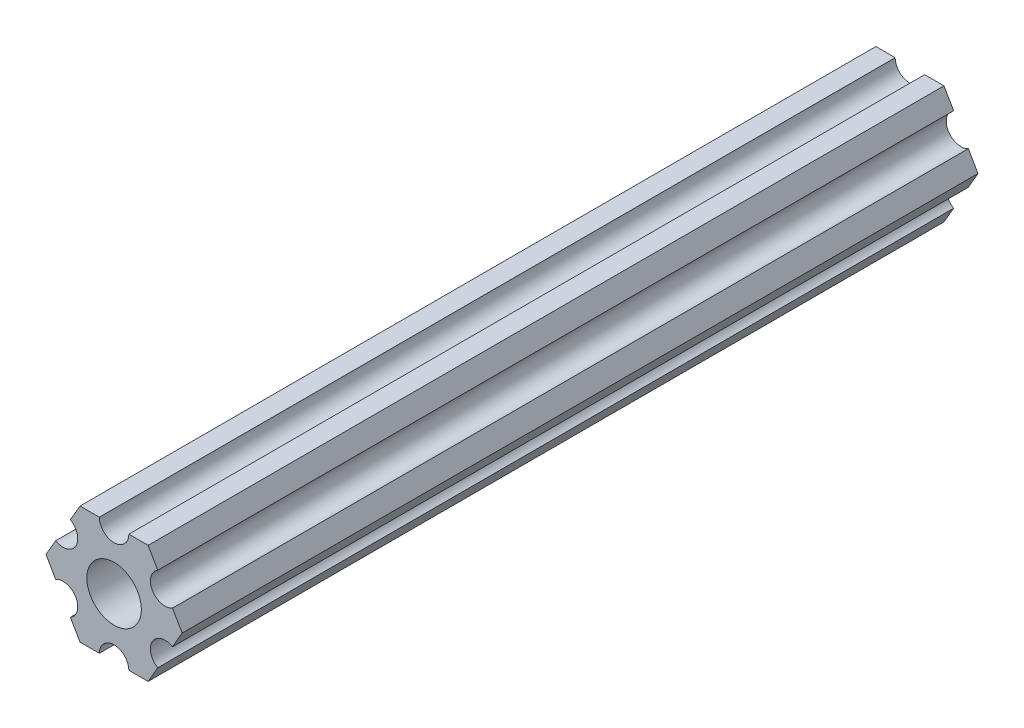
ISO-10303-21;
HEADER;
FILE_DESCRIPTION(('STEP AP214'),'2;1');
FILE_NAME('part.step','',(''),(''),'','','');
FILE_SCHEMA(('AUTOMOTIVE_DESIGN { 1 0 10303 214 1 1 1 1 }'));
ENDSEC;
DATA;
#1=APPLICATION_CONTEXT('core data for automotive mechanical design processes');
#2=APPLICATION_PROTOCOL_DEFINITION('international standard','automotive_design',2000,#1);
#3=PRODUCT_CONTEXT('',#1,'mechanical');
#4=PRODUCT('Part','Part','',(#3));
#5=PRODUCT_RELATED_PRODUCT_CATEGORY('part','',(#4));
#6=PRODUCT_DEFINITION_FORMATION('','',#4);
#7=PRODUCT_DEFINITION_CONTEXT('part definition',#1,'design');
#8=PRODUCT_DEFINITION('design','',#6,#7);
#9=PRODUCT_DEFINITION_SHAPE('','',#8);
#10=(LENGTH_UNIT() NAMED_UNIT(*) SI_UNIT(.MILLI.,.METRE.));
#11=(NAMED_UNIT(*) PLANE_ANGLE_UNIT() SI_UNIT($,.RADIAN.));
#12=(NAMED_UNIT(*) SI_UNIT($,.STERADIAN.) SOLID_ANGLE_UNIT());
#13=UNCERTAINTY_MEASURE_WITH_UNIT(LENGTH_MEASURE(1.E-05),#10,'distance_accuracy_value','');
#14=(GEOMETRIC_REPRESENTATION_CONTEXT(3) GLOBAL_UNCERTAINTY_ASSIGNED_CONTEXT((#13)) GLOBAL_UNIT_ASSIGNED_CONTEXT((#10,
#11,#12)) REPRESENTATION_CONTEXT('',''));
#15=CARTESIAN_POINT('',(0.,0.,0.));
#16=DIRECTION('',(0.,0.,1.));
#17=DIRECTION('',(1.,0.,0.));
#18=AXIS2_PLACEMENT_3D('',#15,#16,#17);
#19=CARTESIAN_POINT('',(1.58750000000001,-6.34999997712759,-85.725));
#20=DIRECTION('',(0.,-1.,0.));
#21=DIRECTION('',(0.,0.,-1.));
#22=AXIS2_PLACEMENT_3D('',#19,#20,#21);
#23=PLANE('',#22);
#24=DIRECTION('',(1.,0.,0.));
#25=VECTOR('',#24,1.);
#26=CARTESIAN_POINT('',(1.58750000000001,-6.34999997712759,0.));
#27=LINE('',#26,#25);
#28=CARTESIAN_POINT('',(1.58750000000001,-6.34999997712759,0.));
#29=VERTEX_POINT('',#28);
#30=CARTESIAN_POINT('',(3.66617417619055,-6.34999997712759,0.));
#31=VERTEX_POINT('',#30);
#32=EDGE_CURVE('E194',#29,#31,#27,.T.);
#33=ORIENTED_EDGE('',*,*,#32,.F.);
#34=DIRECTION('',(0.,0.,1.));
#35=VECTOR('',#34,1.);
#36=CARTESIAN_POINT('',(1.58750000000001,-6.34999997712759,-85.725));
#37=LINE('',#36,#35);
#38=CARTESIAN_POINT('',(1.58750000000001,-6.34999997712759,-85.725));
#39=VERTEX_POINT('',#38);
#40=EDGE_CURVE('E11',#39,#29,#37,.T.);
#41=ORIENTED_EDGE('',*,*,#40,.F.);
#42=DIRECTION('',(1.,0.,0.));
#43=VECTOR('',#42,1.);
#44=CARTESIAN_POINT('',(1.58750000000001,-6.34999997712759,-85.725));
#45=LINE('',#44,#43);
#46=CARTESIAN_POINT('',(3.66617417619055,-6.34999997712759,-85.725));
#47=VERTEX_POINT('',#46);
#48=EDGE_CURVE('E245',#39,#47,#45,.T.);
#49=ORIENTED_EDGE('',*,*,#48,.T.);
#50=DIRECTION('',(0.,0.,1.));
#51=VECTOR('',#50,1.);
#52=CARTESIAN_POINT('',(3.66617417619055,-6.34999997712759,-85.725));
#53=LINE('',#52,#51);
#54=EDGE_CURVE('E40',#47,#31,#53,.T.);
#55=ORIENTED_EDGE('',*,*,#54,.T.);
#56=EDGE_LOOP('',(#33,#41,#49,#55));
#57=FACE_BOUND('',#56,.T.);
#58=ADVANCED_FACE('F37',(#57),#23,.T.);
#59=CARTESIAN_POINT('',(0.,-6.34999997712759,-85.725));
#60=DIRECTION('',(0.,0.,1.));
#61=DIRECTION('',(1.,0.,0.));
#62=AXIS2_PLACEMENT_3D('',#59,#60,#61);
#63=CYLINDRICAL_SURFACE('',#62,1.58750000000001);
#64=CARTESIAN_POINT('',(0.,-6.34999997712759,0.));
#65=DIRECTION('',(0.,0.,-1.));
#66=DIRECTION('',(-1.,0.,0.));
#67=AXIS2_PLACEMENT_3D('',#64,#65,#66);
#68=CIRCLE('',#67,1.58750000000001);
#69=CARTESIAN_POINT('',(-1.58750000000001,-6.34999997712759,0.));
#70=VERTEX_POINT('',#69);
#71=EDGE_CURVE('E243',#70,#29,#68,.T.);
#72=ORIENTED_EDGE('',*,*,#71,.F.);
#73=DIRECTION('',(0.,0.,1.));
#74=VECTOR('',#73,1.);
#75=CARTESIAN_POINT('',(-1.58750000000001,-6.34999997712759,-85.725));
#76=LINE('',#75,#74);
#77=CARTESIAN_POINT('',(-1.58750000000001,-6.34999997712759,-85.725));
#78=VERTEX_POINT('',#77);
#79=EDGE_CURVE('E46',#78,#70,#76,.T.);
#80=ORIENTED_EDGE('',*,*,#79,.F.);
#81=CARTESIAN_POINT('',(0.,-6.34999997712759,-85.725));
#82=DIRECTION('',(0.,0.,-1.));
#83=DIRECTION('',(-1.,0.,0.));
#84=AXIS2_PLACEMENT_3D('',#81,#82,#83);
#85=CIRCLE('',#84,1.58750000000001);
#86=EDGE_CURVE('E184',#78,#39,#85,.T.);
#87=ORIENTED_EDGE('',*,*,#86,.T.);
#88=ORIENTED_EDGE('',*,*,#40,.T.);
#89=EDGE_LOOP('',(#72,#80,#87,#88));
#90=FACE_BOUND('',#89,.T.);
#91=ADVANCED_FACE('F277',(#90),#63,.F.);
#92=CARTESIAN_POINT('',(-3.66617417619055,-6.34999997712759,-85.725));
#93=DIRECTION('',(0.,-1.,0.));
#94=DIRECTION('',(0.,0.,-1.));
#95=AXIS2_PLACEMENT_3D('',#92,#93,#94);
#96=PLANE('',#95);
#97=DIRECTION('',(1.,0.,0.));
#98=VECTOR('',#97,1.);
#99=CARTESIAN_POINT('',(-3.66617417619055,-6.34999997712759,0.));
#100=LINE('',#99,#98);
#101=CARTESIAN_POINT('',(-3.66617417619055,-6.34999997712759,0.));
#102=VERTEX_POINT('',#101);
#103=EDGE_CURVE('E171',#102,#70,#100,.T.);
#104=ORIENTED_EDGE('',*,*,#103,.F.);
#105=DIRECTION('',(0.,0.,1.));
#106=VECTOR('',#105,1.);
#107=CARTESIAN_POINT('',(-3.66617417619055,-6.34999997712759,-85.725));
#108=LINE('',#107,#106);
#109=CARTESIAN_POINT('',(-3.66617417619055,-6.34999997712759,-85.725));
#110=VERTEX_POINT('',#109);
#111=EDGE_CURVE('E166',#110,#102,#108,.T.);
#112=ORIENTED_EDGE('',*,*,#111,.F.);
#113=DIRECTION('',(1.,0.,0.));
#114=VECTOR('',#113,1.);
#115=CARTESIAN_POINT('',(-3.66617417619055,-6.34999997712759,-85.725));
#116=LINE('',#115,#114);
#117=EDGE_CURVE('E169',#110,#78,#116,.T.);
#118=ORIENTED_EDGE('',*,*,#117,.T.);
#119=ORIENTED_EDGE('',*,*,#79,.T.);
#120=EDGE_LOOP('',(#104,#112,#118,#119));
#121=FACE_BOUND('',#120,.T.);
#122=ADVANCED_FACE('F168',(#121),#96,.T.);
#123=CARTESIAN_POINT('',(-4.70551124731177,-4.54981532455591,-85.725));
#124=DIRECTION('',(-0.866025408498969,-0.499999991834193,0.));
#125=DIRECTION('',(0.499999991834193,-0.866025408498969,0.));
#126=AXIS2_PLACEMENT_3D('',#123,#124,#125);
#127=PLANE('',#126);
#128=DIRECTION('',(0.499999991834193,-0.866025408498969,0.));
#129=VECTOR('',#128,1.);
#130=CARTESIAN_POINT('',(-4.70551124731177,-4.54981532455591,0.));
#131=LINE('',#130,#129);
#132=CARTESIAN_POINT('',(-4.70551124731177,-4.54981532455591,0.));
#133=VERTEX_POINT('',#132);
#134=EDGE_CURVE('E240',#133,#102,#131,.T.);
#135=ORIENTED_EDGE('',*,*,#134,.F.);
#136=DIRECTION('',(0.,0.,1.));
#137=VECTOR('',#136,1.);
#138=CARTESIAN_POINT('',(-4.70551124731177,-4.54981532455591,-85.725));
#139=LINE('',#138,#137);
#140=CARTESIAN_POINT('',(-4.70551124731177,-4.54981532455591,-85.725));
#141=VERTEX_POINT('',#140);
#142=EDGE_CURVE('E176',#141,#133,#139,.T.);
#143=ORIENTED_EDGE('',*,*,#142,.F.);
#144=DIRECTION('',(0.499999991834193,-0.866025408498969,0.));
#145=VECTOR('',#144,1.);
#146=CARTESIAN_POINT('',(-4.70551124731177,-4.54981532455591,-85.725));
#147=LINE('',#146,#145);
#148=EDGE_CURVE('E182',#141,#110,#147,.T.);
#149=ORIENTED_EDGE('',*,*,#148,.T.);
#150=ORIENTED_EDGE('',*,*,#111,.T.);
#151=EDGE_LOOP('',(#135,#143,#149,#150));
#152=FACE_BOUND('',#151,.T.);
#153=ADVANCED_FACE('F186',(#152),#127,.T.);
#154=CARTESIAN_POINT('',(-5.49926123434856,-3.17499998856379,-85.725));
#155=DIRECTION('',(0.,0.,1.));
#156=DIRECTION('',(1.,0.,0.));
#157=AXIS2_PLACEMENT_3D('',#154,#155,#156);
#158=CYLINDRICAL_SURFACE('',#157,1.58750000000001);
#159=CARTESIAN_POINT('',(-5.49926123434856,-3.17499998856379,0.));
#160=DIRECTION('',(0.,0.,-1.));
#161=DIRECTION('',(-1.,0.,0.));
#162=AXIS2_PLACEMENT_3D('',#159,#160,#161);
#163=CIRCLE('',#162,1.58750000000001);
#164=CARTESIAN_POINT('',(-6.29301122138534,-1.80018465257167,0.));
#165=VERTEX_POINT('',#164);
#166=EDGE_CURVE('E237',#165,#133,#163,.T.);
#167=ORIENTED_EDGE('',*,*,#166,.F.);
#168=DIRECTION('',(0.,0.,1.));
#169=VECTOR('',#168,1.);
#170=CARTESIAN_POINT('',(-6.29301122138534,-1.80018465257167,-85.725));
#171=LINE('',#170,#169);
#172=CARTESIAN_POINT('',(-6.29301122138534,-1.80018465257167,-85.725));
#173=VERTEX_POINT('',#172);
#174=EDGE_CURVE('E249',#173,#165,#171,.T.);
#175=ORIENTED_EDGE('',*,*,#174,.F.);
#176=CARTESIAN_POINT('',(-5.49926123434856,-3.17499998856379,-85.725));
#177=DIRECTION('',(0.,0.,-1.));
#178=DIRECTION('',(-1.,0.,0.));
#179=AXIS2_PLACEMENT_3D('',#176,#177,#178);
#180=CIRCLE('',#179,1.58750000000001);
#181=EDGE_CURVE('E187',#173,#141,#180,.T.);
#182=ORIENTED_EDGE('',*,*,#181,.T.);
#183=ORIENTED_EDGE('',*,*,#142,.T.);
#184=EDGE_LOOP('',(#167,#175,#182,#183));
#185=FACE_BOUND('',#184,.T.);
#186=ADVANCED_FACE('F290',(#185),#158,.F.);
#187=CARTESIAN_POINT('',(-7.33234829250656,0.,-85.725));
#188=DIRECTION('',(-0.866025408498969,-0.499999991834193,0.));
#189=DIRECTION('',(0.499999991834193,-0.866025408498969,0.));
#190=AXIS2_PLACEMENT_3D('',#187,#188,#189);
#191=PLANE('',#190);
#192=DIRECTION('',(0.499999991834193,-0.866025408498969,0.));
#193=VECTOR('',#192,1.);
#194=CARTESIAN_POINT('',(-7.33234829250656,0.,0.));
#195=LINE('',#194,#193);
#196=CARTESIAN_POINT('',(-7.33234829250656,0.,0.));
#197=VERTEX_POINT('',#196);
#198=EDGE_CURVE('E234',#197,#165,#195,.T.);
#199=ORIENTED_EDGE('',*,*,#198,.F.);
#200=DIRECTION('',(0.,0.,1.));
#201=VECTOR('',#200,1.);
#202=CARTESIAN_POINT('',(-7.33234829250656,0.,-85.725));
#203=LINE('',#202,#201);
#204=CARTESIAN_POINT('',(-7.33234829250656,0.,-85.725));
#205=VERTEX_POINT('',#204);
#206=EDGE_CURVE('E251',#205,#197,#203,.T.);
#207=ORIENTED_EDGE('',*,*,#206,.F.);
#208=DIRECTION('',(0.499999991834193,-0.866025408498969,0.));
#209=VECTOR('',#208,1.);
#210=CARTESIAN_POINT('',(-7.33234829250656,0.,-85.725));
#211=LINE('',#210,#209);
#212=EDGE_CURVE('E189',#205,#173,#211,.T.);
#213=ORIENTED_EDGE('',*,*,#212,.T.);
#214=ORIENTED_EDGE('',*,*,#174,.T.);
#215=EDGE_LOOP('',(#199,#207,#213,#214));
#216=FACE_BOUND('',#215,.T.);
#217=ADVANCED_FACE('F293',(#216),#191,.T.);
#218=CARTESIAN_POINT('',(-6.29301122138534,1.80018465257168,-85.725));
#219=DIRECTION('',(-0.86602540849897,0.499999991834193,0.));
#220=DIRECTION('',(-0.499999991834193,-0.86602540849897,0.));
#221=AXIS2_PLACEMENT_3D('',#218,#219,#220);
#222=PLANE('',#221);
#223=DIRECTION('',(-0.499999991834193,-0.866025408498969,0.));
#224=VECTOR('',#223,1.);
#225=CARTESIAN_POINT('',(-6.29301122138534,1.80018465257168,0.));
#226=LINE('',#225,#224);
#227=CARTESIAN_POINT('',(-6.29301122138534,1.80018465257168,0.));
#228=VERTEX_POINT('',#227);
#229=EDGE_CURVE('E231',#228,#197,#226,.T.);
#230=ORIENTED_EDGE('',*,*,#229,.F.);
#231=DIRECTION('',(0.,0.,1.));
#232=VECTOR('',#231,1.);
#233=CARTESIAN_POINT('',(-6.29301122138534,1.80018465257168,-85.725));
#234=LINE('',#233,#232);
#235=CARTESIAN_POINT('',(-6.29301122138534,1.80018465257168,-85.725));
#236=VERTEX_POINT('',#235);
#237=EDGE_CURVE('E253',#236,#228,#234,.T.);
#238=ORIENTED_EDGE('',*,*,#237,.F.);
#239=DIRECTION('',(-0.499999991834193,-0.866025408498969,0.));
#240=VECTOR('',#239,1.);
#241=CARTESIAN_POINT('',(-6.29301122138534,1.80018465257168,-85.725));
#242=LINE('',#241,#240);
#243=EDGE_CURVE('E398',#236,#205,#242,.T.);
#244=ORIENTED_EDGE('',*,*,#243,.T.);
#245=ORIENTED_EDGE('',*,*,#206,.T.);
#246=EDGE_LOOP('',(#230,#238,#244,#245));
#247=FACE_BOUND('',#246,.T.);
#248=ADVANCED_FACE('F297',(#247),#222,.T.);
#249=CARTESIAN_POINT('',(-5.49926123434856,3.1749999885638,-85.725));
#250=DIRECTION('',(0.,0.,1.));
#251=DIRECTION('',(1.,0.,0.));
#252=AXIS2_PLACEMENT_3D('',#249,#250,#251);
#253=CYLINDRICAL_SURFACE('',#252,1.58750000000001);
#254=CARTESIAN_POINT('',(-5.49926123434856,3.1749999885638,0.));
#255=DIRECTION('',(0.,0.,-1.));
#256=DIRECTION('',(-1.,0.,0.));
#257=AXIS2_PLACEMENT_3D('',#254,#255,#256);
#258=CIRCLE('',#257,1.58750000000001);
#259=CARTESIAN_POINT('',(-4.70551124731177,4.54981532455591,0.));
#260=VERTEX_POINT('',#259);
#261=EDGE_CURVE('E228',#260,#228,#258,.T.);
#262=ORIENTED_EDGE('',*,*,#261,.F.);
#263=DIRECTION('',(0.,0.,1.));
#264=VECTOR('',#263,1.);
#265=CARTESIAN_POINT('',(-4.70551124731177,4.54981532455591,-85.725));
#266=LINE('',#265,#264);
#267=CARTESIAN_POINT('',(-4.70551124731177,4.54981532455591,-85.725));
#268=VERTEX_POINT('',#267);
#269=EDGE_CURVE('E255',#268,#260,#266,.T.);
#270=ORIENTED_EDGE('',*,*,#269,.F.);
#271=CARTESIAN_POINT('',(-5.49926123434856,3.1749999885638,-85.725));
#272=DIRECTION('',(0.,0.,-1.));
#273=DIRECTION('',(-1.,0.,0.));
#274=AXIS2_PLACEMENT_3D('',#271,#272,#273);
#275=CIRCLE('',#274,1.58750000000001);
#276=EDGE_CURVE('E395',#268,#236,#275,.T.);
#277=ORIENTED_EDGE('',*,*,#276,.T.);
#278=ORIENTED_EDGE('',*,*,#237,.T.);
#279=EDGE_LOOP('',(#262,#270,#277,#278));
#280=FACE_BOUND('',#279,.T.);
#281=ADVANCED_FACE('F301',(#280),#253,.F.);
#282=CARTESIAN_POINT('',(-3.66617417619055,6.34999997712759,-85.725));
#283=DIRECTION('',(-0.866025408498969,0.499999991834193,0.));
#284=DIRECTION('',(-0.499999991834193,-0.866025408498969,0.));
#285=AXIS2_PLACEMENT_3D('',#282,#283,#284);
#286=PLANE('',#285);
#287=DIRECTION('',(-0.499999991834193,-0.866025408498969,0.));
#288=VECTOR('',#287,1.);
#289=CARTESIAN_POINT('',(-3.66617417619055,6.34999997712759,0.));
#290=LINE('',#289,#288);
#291=CARTESIAN_POINT('',(-3.66617417619055,6.34999997712759,0.));
#292=VERTEX_POINT('',#291);
#293=EDGE_CURVE('E225',#292,#260,#290,.T.);
#294=ORIENTED_EDGE('',*,*,#293,.F.);
#295=DIRECTION('',(0.,0.,1.));
#296=VECTOR('',#295,1.);
#297=CARTESIAN_POINT('',(-3.66617417619055,6.34999997712759,-85.725));
#298=LINE('',#297,#296);
#299=CARTESIAN_POINT('',(-3.66617417619055,6.34999997712759,-85.725));
#300=VERTEX_POINT('',#299);
#301=EDGE_CURVE('E257',#300,#292,#298,.T.);
#302=ORIENTED_EDGE('',*,*,#301,.F.);
#303=DIRECTION('',(-0.499999991834193,-0.866025408498969,0.));
#304=VECTOR('',#303,1.);
#305=CARTESIAN_POINT('',(-3.66617417619055,6.34999997712759,-85.725));
#306=LINE('',#305,#304);
#307=EDGE_CURVE('E392',#300,#268,#306,.T.);
#308=ORIENTED_EDGE('',*,*,#307,.T.);
#309=ORIENTED_EDGE('',*,*,#269,.T.);
#310=EDGE_LOOP('',(#294,#302,#308,#309));
#311=FACE_BOUND('',#310,.T.);
#312=ADVANCED_FACE('F305',(#311),#286,.T.);
#313=CARTESIAN_POINT('',(-1.58750000000001,6.34999997712759,-85.725));
#314=DIRECTION('',(0.,1.,0.));
#315=DIRECTION('',(0.,0.,1.));
#316=AXIS2_PLACEMENT_3D('',#313,#314,#315);
#317=PLANE('',#316);
#318=DIRECTION('',(-1.,0.,0.));
#319=VECTOR('',#318,1.);
#320=CARTESIAN_POINT('',(-1.58750000000001,6.34999997712759,0.));
#321=LINE('',#320,#319);
#322=CARTESIAN_POINT('',(-1.58750000000001,6.34999997712759,0.));
#323=VERTEX_POINT('',#322);
#324=EDGE_CURVE('E222',#323,#292,#321,.T.);
#325=ORIENTED_EDGE('',*,*,#324,.F.);
#326=DIRECTION('',(0.,0.,1.));
#327=VECTOR('',#326,1.);
#328=CARTESIAN_POINT('',(-1.58750000000001,6.34999997712759,-85.725));
#329=LINE('',#328,#327);
#330=CARTESIAN_POINT('',(-1.58750000000001,6.34999997712759,-85.725));
#331=VERTEX_POINT('',#330);
#332=EDGE_CURVE('E259',#331,#323,#329,.T.);
#333=ORIENTED_EDGE('',*,*,#332,.F.);
#334=DIRECTION('',(-1.,0.,0.));
#335=VECTOR('',#334,1.);
#336=CARTESIAN_POINT('',(-1.58750000000001,6.34999997712759,-85.725));
#337=LINE('',#336,#335);
#338=EDGE_CURVE('E389',#331,#300,#337,.T.);
#339=ORIENTED_EDGE('',*,*,#338,.T.);
#340=ORIENTED_EDGE('',*,*,#301,.T.);
#341=EDGE_LOOP('',(#325,#333,#339,#340));
#342=FACE_BOUND('',#341,.T.);
#343=ADVANCED_FACE('F309',(#342),#317,.T.);
#344=CARTESIAN_POINT('',(0.,6.34999997712759,-85.725));
#345=DIRECTION('',(0.,0.,1.));
#346=DIRECTION('',(1.,0.,0.));
#347=AXIS2_PLACEMENT_3D('',#344,#345,#346);
#348=CYLINDRICAL_SURFACE('',#347,1.58750000000001);
#349=CARTESIAN_POINT('',(0.,6.34999997712759,0.));
#350=DIRECTION('',(0.,0.,-1.));
#351=DIRECTION('',(-1.,0.,0.));
#352=AXIS2_PLACEMENT_3D('',#349,#350,#351);
#353=CIRCLE('',#352,1.58750000000001);
#354=CARTESIAN_POINT('',(1.58750000000001,6.34999997712759,0.));
#355=VERTEX_POINT('',#354);
#356=EDGE_CURVE('E219',#355,#323,#353,.T.);
#357=ORIENTED_EDGE('',*,*,#356,.F.);
#358=DIRECTION('',(0.,0.,1.));
#359=VECTOR('',#358,1.);
#360=CARTESIAN_POINT('',(1.58750000000001,6.34999997712759,-85.725));
#361=LINE('',#360,#359);
#362=CARTESIAN_POINT('',(1.58750000000001,6.34999997712759,-85.725));
#363=VERTEX_POINT('',#362);
#364=EDGE_CURVE('E261',#363,#355,#361,.T.);
#365=ORIENTED_EDGE('',*,*,#364,.F.);
#366=CARTESIAN_POINT('',(0.,6.34999997712759,-85.725));
#367=DIRECTION('',(0.,0.,-1.));
#368=DIRECTION('',(-1.,0.,0.));
#369=AXIS2_PLACEMENT_3D('',#366,#367,#368);
#370=CIRCLE('',#369,1.58750000000001);
#371=EDGE_CURVE('E386',#363,#331,#370,.T.);
#372=ORIENTED_EDGE('',*,*,#371,.T.);
#373=ORIENTED_EDGE('',*,*,#332,.T.);
#374=EDGE_LOOP('',(#357,#365,#372,#373));
#375=FACE_BOUND('',#374,.T.);
#376=ADVANCED_FACE('F313',(#375),#348,.F.);
#377=CARTESIAN_POINT('',(3.66617417619055,6.34999997712759,-85.725));
#378=DIRECTION('',(0.,1.,0.));
#379=DIRECTION('',(0.,0.,1.));
#380=AXIS2_PLACEMENT_3D('',#377,#378,#379);
#381=PLANE('',#380);
#382=DIRECTION('',(-1.,0.,0.));
#383=VECTOR('',#382,1.);
#384=CARTESIAN_POINT('',(3.66617417619055,6.34999997712759,0.));
#385=LINE('',#384,#383);
#386=CARTESIAN_POINT('',(3.66617417619055,6.34999997712759,0.));
#387=VERTEX_POINT('',#386);
#388=EDGE_CURVE('E216',#387,#355,#385,.T.);
#389=ORIENTED_EDGE('',*,*,#388,.F.);
#390=DIRECTION('',(0.,0.,1.));
#391=VECTOR('',#390,1.);
#392=CARTESIAN_POINT('',(3.66617417619055,6.34999997712759,-85.725));
#393=LINE('',#392,#391);
#394=CARTESIAN_POINT('',(3.66617417619055,6.34999997712759,-85.725));
#395=VERTEX_POINT('',#394);
#396=EDGE_CURVE('E263',#395,#387,#393,.T.);
#397=ORIENTED_EDGE('',*,*,#396,.F.);
#398=DIRECTION('',(-1.,0.,0.));
#399=VECTOR('',#398,1.);
#400=CARTESIAN_POINT('',(3.66617417619055,6.34999997712759,-85.725));
#401=LINE('',#400,#399);
#402=EDGE_CURVE('E383',#395,#363,#401,.T.);
#403=ORIENTED_EDGE('',*,*,#402,.T.);
#404=ORIENTED_EDGE('',*,*,#364,.T.);
#405=EDGE_LOOP('',(#389,#397,#403,#404));
#406=FACE_BOUND('',#405,.T.);
#407=ADVANCED_FACE('F317',(#406),#381,.T.);
#408=CARTESIAN_POINT('',(4.70551124731177,4.54981532455591,-85.725));
#409=DIRECTION('',(0.866025408498969,0.499999991834193,0.));
#410=DIRECTION('',(-0.499999991834193,0.866025408498969,0.));
#411=AXIS2_PLACEMENT_3D('',#408,#409,#410);
#412=PLANE('',#411);
#413=DIRECTION('',(-0.499999991834193,0.866025408498969,0.));
#414=VECTOR('',#413,1.);
#415=CARTESIAN_POINT('',(4.70551124731177,4.54981532455591,0.));
#416=LINE('',#415,#414);
#417=CARTESIAN_POINT('',(4.70551124731177,4.54981532455591,0.));
#418=VERTEX_POINT('',#417);
#419=EDGE_CURVE('E213',#418,#387,#416,.T.);
#420=ORIENTED_EDGE('',*,*,#419,.F.);
#421=DIRECTION('',(0.,0.,1.));
#422=VECTOR('',#421,1.);
#423=CARTESIAN_POINT('',(4.70551124731177,4.54981532455591,-85.725));
#424=LINE('',#423,#422);
#425=CARTESIAN_POINT('',(4.70551124731177,4.54981532455591,-85.725));
#426=VERTEX_POINT('',#425);
#427=EDGE_CURVE('E265',#426,#418,#424,.T.);
#428=ORIENTED_EDGE('',*,*,#427,.F.);
#429=DIRECTION('',(-0.499999991834193,0.866025408498969,0.));
#430=VECTOR('',#429,1.);
#431=CARTESIAN_POINT('',(4.70551124731177,4.54981532455591,-85.725));
#432=LINE('',#431,#430);
#433=EDGE_CURVE('E380',#426,#395,#432,.T.);
#434=ORIENTED_EDGE('',*,*,#433,.T.);
#435=ORIENTED_EDGE('',*,*,#396,.T.);
#436=EDGE_LOOP('',(#420,#428,#434,#435));
#437=FACE_BOUND('',#436,.T.);
#438=ADVANCED_FACE('F321',(#437),#412,.T.);
#439=CARTESIAN_POINT('',(5.49926123434856,3.1749999885638,-85.725));
#440=DIRECTION('',(0.,0.,1.));
#441=DIRECTION('',(1.,0.,0.));
#442=AXIS2_PLACEMENT_3D('',#439,#440,#441);
#443=CYLINDRICAL_SURFACE('',#442,1.58750000000001);
#444=CARTESIAN_POINT('',(5.49926123434856,3.1749999885638,0.));
#445=DIRECTION('',(0.,0.,-1.));
#446=DIRECTION('',(-1.,0.,0.));
#447=AXIS2_PLACEMENT_3D('',#444,#445,#446);
#448=CIRCLE('',#447,1.58750000000001);
#449=CARTESIAN_POINT('',(6.29301122138534,1.80018465257168,0.));
#450=VERTEX_POINT('',#449);
#451=EDGE_CURVE('E210',#450,#418,#448,.T.);
#452=ORIENTED_EDGE('',*,*,#451,.F.);
#453=DIRECTION('',(0.,0.,1.));
#454=VECTOR('',#453,1.);
#455=CARTESIAN_POINT('',(6.29301122138534,1.80018465257168,-85.725));
#456=LINE('',#455,#454);
#457=CARTESIAN_POINT('',(6.29301122138534,1.80018465257168,-85.725));
#458=VERTEX_POINT('',#457);
#459=EDGE_CURVE('E267',#458,#450,#456,.T.);
#460=ORIENTED_EDGE('',*,*,#459,.F.);
#461=CARTESIAN_POINT('',(5.49926123434856,3.1749999885638,-85.725));
#462=DIRECTION('',(0.,0.,-1.));
#463=DIRECTION('',(-1.,0.,0.));
#464=AXIS2_PLACEMENT_3D('',#461,#462,#463);
#465=CIRCLE('',#464,1.58750000000001);
#466=EDGE_CURVE('E377',#458,#426,#465,.T.);
#467=ORIENTED_EDGE('',*,*,#466,.T.);
#468=ORIENTED_EDGE('',*,*,#427,.T.);
#469=EDGE_LOOP('',(#452,#460,#467,#468));
#470=FACE_BOUND('',#469,.T.);
#471=ADVANCED_FACE('F325',(#470),#443,.F.);
#472=CARTESIAN_POINT('',(7.33234829250656,0.,-85.725));
#473=DIRECTION('',(0.86602540849897,0.499999991834193,0.));
#474=DIRECTION('',(-0.499999991834193,0.86602540849897,0.));
#475=AXIS2_PLACEMENT_3D('',#472,#473,#474);
#476=PLANE('',#475);
#477=DIRECTION('',(-0.499999991834193,0.866025408498969,0.));
#478=VECTOR('',#477,1.);
#479=CARTESIAN_POINT('',(7.33234829250656,0.,0.));
#480=LINE('',#479,#478);
#481=CARTESIAN_POINT('',(7.33234829250656,0.,0.));
#482=VERTEX_POINT('',#481);
#483=EDGE_CURVE('E207',#482,#450,#480,.T.);
#484=ORIENTED_EDGE('',*,*,#483,.F.);
#485=DIRECTION('',(0.,0.,1.));
#486=VECTOR('',#485,1.);
#487=CARTESIAN_POINT('',(7.33234829250656,0.,-85.725));
#488=LINE('',#487,#486);
#489=CARTESIAN_POINT('',(7.33234829250656,0.,-85.725));
#490=VERTEX_POINT('',#489);
#491=EDGE_CURVE('E269',#490,#482,#488,.T.);
#492=ORIENTED_EDGE('',*,*,#491,.F.);
#493=DIRECTION('',(-0.499999991834193,0.866025408498969,0.));
#494=VECTOR('',#493,1.);
#495=CARTESIAN_POINT('',(7.33234829250656,0.,-85.725));
#496=LINE('',#495,#494);
#497=EDGE_CURVE('E374',#490,#458,#496,.T.);
#498=ORIENTED_EDGE('',*,*,#497,.T.);
#499=ORIENTED_EDGE('',*,*,#459,.T.);
#500=EDGE_LOOP('',(#484,#492,#498,#499));
#501=FACE_BOUND('',#500,.T.);
#502=ADVANCED_FACE('F329',(#501),#476,.T.);
#503=CARTESIAN_POINT('',(6.29301122138534,-1.80018465257167,-85.725));
#504=DIRECTION('',(0.866025408498969,-0.499999991834193,0.));
#505=DIRECTION('',(0.499999991834193,0.866025408498969,0.));
#506=AXIS2_PLACEMENT_3D('',#503,#504,#505);
#507=PLANE('',#506);
#508=DIRECTION('',(0.499999991834193,0.866025408498969,0.));
#509=VECTOR('',#508,1.);
#510=CARTESIAN_POINT('',(6.29301122138534,-1.80018465257167,0.));
#511=LINE('',#510,#509);
#512=CARTESIAN_POINT('',(6.29301122138534,-1.80018465257168,0.));
#513=VERTEX_POINT('',#512);
#514=EDGE_CURVE('E204',#513,#482,#511,.T.);
#515=ORIENTED_EDGE('',*,*,#514,.F.);
#516=DIRECTION('',(0.,0.,1.));
#517=VECTOR('',#516,1.);
#518=CARTESIAN_POINT('',(6.29301122138534,-1.80018465257168,-85.725));
#519=LINE('',#518,#517);
#520=CARTESIAN_POINT('',(6.29301122138534,-1.80018465257168,-85.725));
#521=VERTEX_POINT('',#520);
#522=EDGE_CURVE('E271',#521,#513,#519,.T.);
#523=ORIENTED_EDGE('',*,*,#522,.F.);
#524=DIRECTION('',(0.499999991834193,0.866025408498969,0.));
#525=VECTOR('',#524,1.);
#526=CARTESIAN_POINT('',(6.29301122138534,-1.80018465257167,-85.725));
#527=LINE('',#526,#525);
#528=EDGE_CURVE('E371',#521,#490,#527,.T.);
#529=ORIENTED_EDGE('',*,*,#528,.T.);
#530=ORIENTED_EDGE('',*,*,#491,.T.);
#531=EDGE_LOOP('',(#515,#523,#529,#530));
#532=FACE_BOUND('',#531,.T.);
#533=ADVANCED_FACE('F333',(#532),#507,.T.);
#534=CARTESIAN_POINT('',(5.49926123434856,-3.17499998856379,-85.725));
#535=DIRECTION('',(0.,0.,1.));
#536=DIRECTION('',(1.,0.,0.));
#537=AXIS2_PLACEMENT_3D('',#534,#535,#536);
#538=CYLINDRICAL_SURFACE('',#537,1.58750000000001);
#539=CARTESIAN_POINT('',(5.49926123434856,-3.17499998856379,0.));
#540=DIRECTION('',(0.,0.,-1.));
#541=DIRECTION('',(-1.,0.,0.));
#542=AXIS2_PLACEMENT_3D('',#539,#540,#541);
#543=CIRCLE('',#542,1.58750000000001);
#544=CARTESIAN_POINT('',(4.70551124731177,-4.54981532455591,0.));
#545=VERTEX_POINT('',#544);
#546=EDGE_CURVE('E201',#545,#513,#543,.T.);
#547=ORIENTED_EDGE('',*,*,#546,.F.);
#548=DIRECTION('',(0.,0.,1.));
#549=VECTOR('',#548,1.);
#550=CARTESIAN_POINT('',(4.70551124731177,-4.54981532455591,-85.725));
#551=LINE('',#550,#549);
#552=CARTESIAN_POINT('',(4.70551124731177,-4.54981532455591,-85.725));
#553=VERTEX_POINT('',#552);
#554=EDGE_CURVE('E272',#553,#545,#551,.T.);
#555=ORIENTED_EDGE('',*,*,#554,.F.);
#556=CARTESIAN_POINT('',(5.49926123434856,-3.17499998856379,-85.725));
#557=DIRECTION('',(0.,0.,-1.));
#558=DIRECTION('',(-1.,0.,0.));
#559=AXIS2_PLACEMENT_3D('',#556,#557,#558);
#560=CIRCLE('',#559,1.58750000000001);
#561=EDGE_CURVE('E368',#553,#521,#560,.T.);
#562=ORIENTED_EDGE('',*,*,#561,.T.);
#563=ORIENTED_EDGE('',*,*,#522,.T.);
#564=EDGE_LOOP('',(#547,#555,#562,#563));
#565=FACE_BOUND('',#564,.T.);
#566=ADVANCED_FACE('F337',(#565),#538,.F.);
#567=CARTESIAN_POINT('',(3.66617417619055,-6.34999997712759,-85.725));
#568=DIRECTION('',(0.866025408498969,-0.499999991834193,0.));
#569=DIRECTION('',(0.499999991834193,0.866025408498969,0.));
#570=AXIS2_PLACEMENT_3D('',#567,#568,#569);
#571=PLANE('',#570);
#572=DIRECTION('',(0.499999991834193,0.866025408498969,0.));
#573=VECTOR('',#572,1.);
#574=CARTESIAN_POINT('',(3.66617417619055,-6.34999997712759,0.));
#575=LINE('',#574,#573);
#576=EDGE_CURVE('E197',#31,#545,#575,.T.);
#577=ORIENTED_EDGE('',*,*,#576,.F.);
#578=ORIENTED_EDGE('',*,*,#54,.F.);
#579=DIRECTION('',(0.499999991834193,0.866025408498969,0.));
#580=VECTOR('',#579,1.);
#581=CARTESIAN_POINT('',(3.66617417619055,-6.34999997712759,-85.725));
#582=LINE('',#581,#580);
#583=EDGE_CURVE('E366',#47,#553,#582,.T.);
#584=ORIENTED_EDGE('',*,*,#583,.T.);
#585=ORIENTED_EDGE('',*,*,#554,.T.);
#586=EDGE_LOOP('',(#577,#578,#584,#585));
#587=FACE_BOUND('',#586,.T.);
#588=ADVANCED_FACE('F274',(#587),#571,.T.);
#589=CARTESIAN_POINT('',(5.49926123434856,-3.17499998856379,-85.725));
#590=DIRECTION('',(0.,0.,-1.));
#591=DIRECTION('',(-1.,0.,0.));
#592=AXIS2_PLACEMENT_3D('',#589,#590,#591);
#593=PLANE('',#592);
#594=CARTESIAN_POINT('',(0.,0.,-85.725));
#595=DIRECTION('',(0.,0.,1.));
#596=DIRECTION('',(-1.,0.,0.));
#597=AXIS2_PLACEMENT_3D('',#594,#595,#596);
#598=CIRCLE('',#597,2.9337);
#599=CARTESIAN_POINT('',(-2.9337,0.,-85.725));
#600=VERTEX_POINT('',#599);
#601=EDGE_CURVE('E198',#600,#600,#598,.T.);
#602=ORIENTED_EDGE('',*,*,#601,.T.);
#603=EDGE_LOOP('',(#602));
#604=FACE_BOUND('',#603,.T.);
#605=ORIENTED_EDGE('',*,*,#48,.F.);
#606=ORIENTED_EDGE('',*,*,#86,.F.);
#607=ORIENTED_EDGE('',*,*,#117,.F.);
#608=ORIENTED_EDGE('',*,*,#148,.F.);
#609=ORIENTED_EDGE('',*,*,#181,.F.);
#610=ORIENTED_EDGE('',*,*,#212,.F.);
#611=ORIENTED_EDGE('',*,*,#243,.F.);
#612=ORIENTED_EDGE('',*,*,#276,.F.);
#613=ORIENTED_EDGE('',*,*,#307,.F.);
#614=ORIENTED_EDGE('',*,*,#338,.F.);
#615=ORIENTED_EDGE('',*,*,#371,.F.);
#616=ORIENTED_EDGE('',*,*,#402,.F.);
#617=ORIENTED_EDGE('',*,*,#433,.F.);
#618=ORIENTED_EDGE('',*,*,#466,.F.);
#619=ORIENTED_EDGE('',*,*,#497,.F.);
#620=ORIENTED_EDGE('',*,*,#528,.F.);
#621=ORIENTED_EDGE('',*,*,#561,.F.);
#622=ORIENTED_EDGE('',*,*,#583,.F.);
#623=EDGE_LOOP('',(#605,#606,#607,#608,#609,#610,#611,#612,#613,#614,#615,#616,#617,#618,#619,
#620,#621,#622));
#624=FACE_BOUND('',#623,.T.);
#625=ADVANCED_FACE('F180',(#604,#624),#593,.T.);
#626=CARTESIAN_POINT('',(5.49926123434856,-3.17499998856379,0.));
#627=DIRECTION('',(0.,0.,-1.));
#628=DIRECTION('',(-1.,0.,0.));
#629=AXIS2_PLACEMENT_3D('',#626,#627,#628);
#630=PLANE('',#629);
#631=CARTESIAN_POINT('',(0.,0.,0.));
#632=DIRECTION('',(0.,0.,1.));
#633=DIRECTION('',(-1.,0.,0.));
#634=AXIS2_PLACEMENT_3D('',#631,#632,#633);
#635=CIRCLE('',#634,2.9337);
#636=CARTESIAN_POINT('',(-2.9337,0.,0.));
#637=VERTEX_POINT('',#636);
#638=EDGE_CURVE('E361',#637,#637,#635,.T.);
#639=ORIENTED_EDGE('',*,*,#638,.F.);
#640=EDGE_LOOP('',(#639));
#641=FACE_BOUND('',#640,.T.);
#642=ORIENTED_EDGE('',*,*,#32,.T.);
#643=ORIENTED_EDGE('',*,*,#576,.T.);
#644=ORIENTED_EDGE('',*,*,#546,.T.);
#645=ORIENTED_EDGE('',*,*,#514,.T.);
#646=ORIENTED_EDGE('',*,*,#483,.T.);
#647=ORIENTED_EDGE('',*,*,#451,.T.);
#648=ORIENTED_EDGE('',*,*,#419,.T.);
#649=ORIENTED_EDGE('',*,*,#388,.T.);
#650=ORIENTED_EDGE('',*,*,#356,.T.);
#651=ORIENTED_EDGE('',*,*,#324,.T.);
#652=ORIENTED_EDGE('',*,*,#293,.T.);
#653=ORIENTED_EDGE('',*,*,#261,.T.);
#654=ORIENTED_EDGE('',*,*,#229,.T.);
#655=ORIENTED_EDGE('',*,*,#198,.T.);
#656=ORIENTED_EDGE('',*,*,#166,.T.);
#657=ORIENTED_EDGE('',*,*,#134,.T.);
#658=ORIENTED_EDGE('',*,*,#103,.T.);
#659=ORIENTED_EDGE('',*,*,#71,.T.);
#660=EDGE_LOOP('',(#642,#643,#644,#645,#646,#647,#648,#649,#650,#651,#652,#653,#654,#655,#656,
#657,#658,#659));
#661=FACE_BOUND('',#660,.T.);
#662=ADVANCED_FACE('F276',(#641,#661),#630,.F.);
#663=CARTESIAN_POINT('',(0.,0.,-85.725));
#664=DIRECTION('',(0.,0.,1.));
#665=DIRECTION('',(1.,0.,0.));
#666=AXIS2_PLACEMENT_3D('',#663,#664,#665);
#667=CYLINDRICAL_SURFACE('',#666,2.9337);
#668=ORIENTED_EDGE('',*,*,#601,.F.);
#669=EDGE_LOOP('',(#668));
#670=FACE_BOUND('',#669,.T.);
#671=ORIENTED_EDGE('',*,*,#638,.T.);
#672=EDGE_LOOP('',(#671));
#673=FACE_BOUND('',#672,.T.);
#674=ADVANCED_FACE('F349',(#670,#673),#667,.F.);
#675=CLOSED_SHELL('',(#58,#91,#122,#153,#186,#217,#248,#281,#312,#343,#376,#407,#438,#471,#502,
#533,#566,#588,#625,#662,#674));
#676=MANIFOLD_SOLID_BREP('B2',#675);
#677=ADVANCED_BREP_SHAPE_REPRESENTATION('',(#18,#676),#14);
#678=SHAPE_DEFINITION_REPRESENTATION(#9,#677);
ENDSEC;
END-ISO-10303-21;
